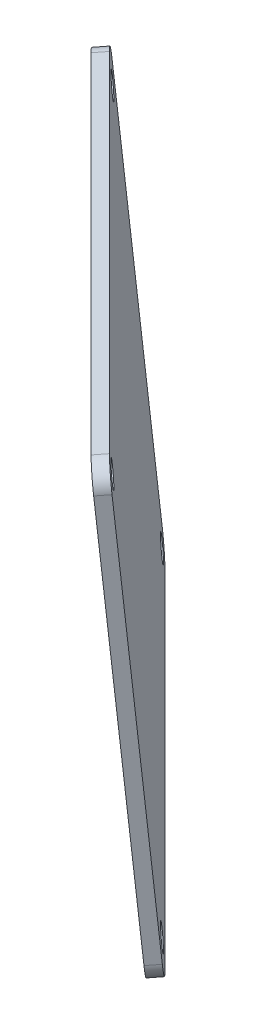
ISO-10303-21;
HEADER;
FILE_DESCRIPTION(('STEP AP214'),'2;1');
FILE_NAME('part.step','',(''),(''),'','','');
FILE_SCHEMA(('AUTOMOTIVE_DESIGN { 1 0 10303 214 1 1 1 1 }'));
ENDSEC;
DATA;
#1=APPLICATION_CONTEXT('core data for automotive mechanical design processes');
#2=APPLICATION_PROTOCOL_DEFINITION('international standard','automotive_design',2000,#1);
#3=PRODUCT_CONTEXT('',#1,'mechanical');
#4=PRODUCT('Part','Part','',(#3));
#5=PRODUCT_RELATED_PRODUCT_CATEGORY('part','',(#4));
#6=PRODUCT_DEFINITION_FORMATION('','',#4);
#7=PRODUCT_DEFINITION_CONTEXT('part definition',#1,'design');
#8=PRODUCT_DEFINITION('design','',#6,#7);
#9=PRODUCT_DEFINITION_SHAPE('','',#8);
#10=(LENGTH_UNIT() NAMED_UNIT(*) SI_UNIT(.MILLI.,.METRE.));
#11=(NAMED_UNIT(*) PLANE_ANGLE_UNIT() SI_UNIT($,.RADIAN.));
#12=(NAMED_UNIT(*) SI_UNIT($,.STERADIAN.) SOLID_ANGLE_UNIT());
#13=UNCERTAINTY_MEASURE_WITH_UNIT(LENGTH_MEASURE(1.E-05),#10,'distance_accuracy_value','');
#14=(GEOMETRIC_REPRESENTATION_CONTEXT(3) GLOBAL_UNCERTAINTY_ASSIGNED_CONTEXT((#13)) GLOBAL_UNIT_ASSIGNED_CONTEXT((#10,
#11,#12)) REPRESENTATION_CONTEXT('',''));
#15=CARTESIAN_POINT('',(0.,0.,0.));
#16=DIRECTION('',(0.,0.,1.));
#17=DIRECTION('',(1.,0.,0.));
#18=AXIS2_PLACEMENT_3D('',#15,#16,#17);
#19=CARTESIAN_POINT('',(24.477654356195,47.3995662297996,-60.7574005593814));
#20=DIRECTION('',(0.704416026402758,0.0871557427476584,-0.704416026402759));
#21=DIRECTION('',(-0.707106781186548,0.,-0.707106781186547));
#22=AXIS2_PLACEMENT_3D('',#19,#20,#21);
#23=CYLINDRICAL_SURFACE('',#22,2.54);
#24=CARTESIAN_POINT('',(25.5959147981094,47.5379259714115,-61.8756610012958));
#25=DIRECTION('',(0.704416026402758,0.0871557427476584,-0.704416026402759));
#26=DIRECTION('',(0.707106781186548,0.,0.707106781186547));
#27=AXIS2_PLACEMENT_3D('',#24,#25,#26);
#28=CIRCLE('',#27,2.54);
#29=CARTESIAN_POINT('',(25.7524509765686,45.0075914382585,-62.032197179755));
#30=VERTEX_POINT('',#29);
#31=CARTESIAN_POINT('',(23.7998635738956,47.5379259714115,-63.6717122255096));
#32=VERTEX_POINT('',#31);
#33=EDGE_CURVE('E130',#30,#32,#28,.T.);
#34=ORIENTED_EDGE('',*,*,#33,.F.);
#35=DIRECTION('',(0.704416026402758,0.0871557427476584,-0.704416026402759));
#36=VECTOR('',#35,1.);
#37=CARTESIAN_POINT('',(24.6341905346542,44.8692316966466,-60.9139367378406));
#38=LINE('',#37,#36);
#39=CARTESIAN_POINT('',(24.6341905346542,44.8692316966466,-60.9139367378406));
#40=VERTEX_POINT('',#39);
#41=EDGE_CURVE('E11',#40,#30,#38,.T.);
#42=ORIENTED_EDGE('',*,*,#41,.F.);
#43=CARTESIAN_POINT('',(24.477654356195,47.3995662297996,-60.7574005593814));
#44=DIRECTION('',(0.704416026402758,0.0871557427476584,-0.704416026402759));
#45=DIRECTION('',(0.707106781186548,0.,0.707106781186547));
#46=AXIS2_PLACEMENT_3D('',#43,#44,#45);
#47=CIRCLE('',#46,2.54);
#48=CARTESIAN_POINT('',(22.6816031319812,47.3995662297996,-62.5534517835953));
#49=VERTEX_POINT('',#48);
#50=EDGE_CURVE('E151',#40,#49,#47,.T.);
#51=ORIENTED_EDGE('',*,*,#50,.T.);
#52=DIRECTION('',(0.704416026402758,0.0871557427476584,-0.704416026402759));
#53=VECTOR('',#52,1.);
#54=CARTESIAN_POINT('',(22.6816031319812,47.3995662297996,-62.5534517835953));
#55=LINE('',#54,#53);
#56=EDGE_CURVE('E36',#49,#32,#55,.T.);
#57=ORIENTED_EDGE('',*,*,#56,.T.);
#58=EDGE_LOOP('',(#34,#42,#51,#57));
#59=FACE_BOUND('',#58,.T.);
#60=ADVANCED_FACE('F33',(#59),#23,.T.);
#61=CARTESIAN_POINT('',(24.6341905346542,44.8692316966466,-60.9139367378406));
#62=DIRECTION('',(0.0616284167162195,-0.996194698091745,-0.0616284167162195));
#63=DIRECTION('',(0.,0.0617457854184493,-0.998091908585106));
#64=AXIS2_PLACEMENT_3D('',#61,#62,#63);
#65=PLANE('',#64);
#66=DIRECTION('',(-0.707106781186548,0.,-0.707106781186547));
#67=VECTOR('',#66,1.);
#68=CARTESIAN_POINT('',(25.7524509765686,45.0075914382585,-62.032197179755));
#69=LINE('',#68,#67);
#70=CARTESIAN_POINT('',(68.1841611486203,45.0075914382585,-19.6004870077033));
#71=VERTEX_POINT('',#70);
#72=EDGE_CURVE('E149',#71,#30,#69,.T.);
#73=ORIENTED_EDGE('',*,*,#72,.F.);
#74=DIRECTION('',(0.704416026402758,0.0871557427476584,-0.704416026402759));
#75=VECTOR('',#74,1.);
#76=CARTESIAN_POINT('',(67.065900706706,44.8692316966466,-18.4822265657889));
#77=LINE('',#76,#75);
#78=CARTESIAN_POINT('',(67.065900706706,44.8692316966466,-18.4822265657889));
#79=VERTEX_POINT('',#78);
#80=EDGE_CURVE('E42',#79,#71,#77,.T.);
#81=ORIENTED_EDGE('',*,*,#80,.F.);
#82=DIRECTION('',(-0.707106781186548,0.,-0.707106781186547));
#83=VECTOR('',#82,1.);
#84=CARTESIAN_POINT('',(24.6341905346542,44.8692316966466,-60.9139367378406));
#85=LINE('',#84,#83);
#86=EDGE_CURVE('E120',#79,#40,#85,.T.);
#87=ORIENTED_EDGE('',*,*,#86,.T.);
#88=ORIENTED_EDGE('',*,*,#41,.T.);
#89=EDGE_LOOP('',(#73,#81,#87,#88));
#90=FACE_BOUND('',#89,.T.);
#91=ADVANCED_FACE('F163',(#90),#65,.T.);
#92=CARTESIAN_POINT('',(66.9093645282468,47.3995662297996,-18.3256903873297));
#93=DIRECTION('',(0.704416026402758,0.0871557427476584,-0.704416026402759));
#94=DIRECTION('',(-0.707106781186548,0.,-0.707106781186547));
#95=AXIS2_PLACEMENT_3D('',#92,#93,#94);
#96=CYLINDRICAL_SURFACE('',#95,2.54);
#97=CARTESIAN_POINT('',(68.0276249701612,47.5379259714115,-19.4439508292441));
#98=DIRECTION('',(0.704416026402758,0.0871557427476584,-0.704416026402759));
#99=DIRECTION('',(0.707106781186548,0.,0.707106781186547));
#100=AXIS2_PLACEMENT_3D('',#97,#98,#99);
#101=CIRCLE('',#100,2.54);
#102=CARTESIAN_POINT('',(69.823676194375,47.5379259714115,-17.6478996050302));
#103=VERTEX_POINT('',#102);
#104=EDGE_CURVE('E107',#103,#71,#101,.T.);
#105=ORIENTED_EDGE('',*,*,#104,.F.);
#106=DIRECTION('',(0.704416026402758,0.0871557427476584,-0.704416026402759));
#107=VECTOR('',#106,1.);
#108=CARTESIAN_POINT('',(68.7054157524606,47.3995662297996,-16.5296391631159));
#109=LINE('',#108,#107);
#110=CARTESIAN_POINT('',(68.7054157524606,47.3995662297996,-16.5296391631159));
#111=VERTEX_POINT('',#110);
#112=EDGE_CURVE('E102',#111,#103,#109,.T.);
#113=ORIENTED_EDGE('',*,*,#112,.F.);
#114=CARTESIAN_POINT('',(66.9093645282468,47.3995662297996,-18.3256903873297));
#115=DIRECTION('',(0.704416026402758,0.0871557427476584,-0.704416026402759));
#116=DIRECTION('',(0.707106781186548,0.,0.707106781186547));
#117=AXIS2_PLACEMENT_3D('',#114,#115,#116);
#118=CIRCLE('',#117,2.54);
#119=EDGE_CURVE('E105',#111,#79,#118,.T.);
#120=ORIENTED_EDGE('',*,*,#119,.T.);
#121=ORIENTED_EDGE('',*,*,#80,.T.);
#122=EDGE_LOOP('',(#105,#113,#120,#121));
#123=FACE_BOUND('',#122,.T.);
#124=ADVANCED_FACE('F104',(#123),#96,.T.);
#125=CARTESIAN_POINT('',(65.6406021531542,96.9408528789011,-13.4648255638095));
#126=DIRECTION('',(0.707106781186548,0.,0.707106781186547));
#127=DIRECTION('',(0.707106781186547,0.,-0.707106781186548));
#128=AXIS2_PLACEMENT_3D('',#125,#126,#127);
#129=PLANE('',#128);
#130=DIRECTION('',(0.0616284167162195,-0.996194698091746,-0.0616284167162196));
#131=VECTOR('',#130,1.);
#132=CARTESIAN_POINT('',(66.7588625950686,97.079212620513,-14.5830860057238));
#133=LINE('',#132,#131);
#134=CARTESIAN_POINT('',(66.7588625950686,97.079212620513,-14.5830860057238));
#135=VERTEX_POINT('',#134);
#136=EDGE_CURVE('E146',#135,#103,#133,.T.);
#137=ORIENTED_EDGE('',*,*,#136,.F.);
#138=DIRECTION('',(0.704416026402758,0.0871557427476584,-0.704416026402759));
#139=VECTOR('',#138,1.);
#140=CARTESIAN_POINT('',(65.6406021531542,96.9408528789011,-13.4648255638095));
#141=LINE('',#140,#139);
#142=CARTESIAN_POINT('',(65.6406021531542,96.9408528789011,-13.4648255638095));
#143=VERTEX_POINT('',#142);
#144=EDGE_CURVE('E112',#143,#135,#141,.T.);
#145=ORIENTED_EDGE('',*,*,#144,.F.);
#146=DIRECTION('',(0.0616284167162195,-0.996194698091746,-0.0616284167162196));
#147=VECTOR('',#146,1.);
#148=CARTESIAN_POINT('',(65.6406021531542,96.9408528789011,-13.4648255638095));
#149=LINE('',#148,#147);
#150=EDGE_CURVE('E118',#143,#111,#149,.T.);
#151=ORIENTED_EDGE('',*,*,#150,.T.);
#152=ORIENTED_EDGE('',*,*,#112,.T.);
#153=EDGE_LOOP('',(#137,#145,#151,#152));
#154=FACE_BOUND('',#153,.T.);
#155=ADVANCED_FACE('F122',(#154),#129,.T.);
#156=CARTESIAN_POINT('',(63.8445509289404,96.9408528789011,-15.2608767880233));
#157=DIRECTION('',(0.704416026402758,0.0871557427476584,-0.704416026402759));
#158=DIRECTION('',(-0.707106781186548,0.,-0.707106781186547));
#159=AXIS2_PLACEMENT_3D('',#156,#157,#158);
#160=CYLINDRICAL_SURFACE('',#159,2.53999999999999);
#161=CARTESIAN_POINT('',(64.9628113708548,97.079212620513,-16.3791372299377));
#162=DIRECTION('',(0.704416026402758,0.0871557427476584,-0.704416026402759));
#163=DIRECTION('',(-0.707106781186548,0.,-0.707106781186547));
#164=AXIS2_PLACEMENT_3D('',#161,#162,#163);
#165=CIRCLE('',#164,2.53999999999999);
#166=CARTESIAN_POINT('',(64.8062751923956,99.609547153666,-16.2226010514785));
#167=VERTEX_POINT('',#166);
#168=EDGE_CURVE('E143',#167,#135,#165,.T.);
#169=ORIENTED_EDGE('',*,*,#168,.F.);
#170=DIRECTION('',(0.704416026402758,0.0871557427476584,-0.704416026402759));
#171=VECTOR('',#170,1.);
#172=CARTESIAN_POINT('',(63.6880147504812,99.4711874120541,-15.1043406095641));
#173=LINE('',#172,#171);
#174=CARTESIAN_POINT('',(63.6880147504812,99.4711874120541,-15.1043406095641));
#175=VERTEX_POINT('',#174);
#176=EDGE_CURVE('E155',#175,#167,#173,.T.);
#177=ORIENTED_EDGE('',*,*,#176,.F.);
#178=CARTESIAN_POINT('',(63.8445509289404,96.9408528789011,-15.2608767880233));
#179=DIRECTION('',(0.704416026402758,0.0871557427476584,-0.704416026402759));
#180=DIRECTION('',(-0.707106781186548,0.,-0.707106781186547));
#181=AXIS2_PLACEMENT_3D('',#178,#179,#180);
#182=CIRCLE('',#181,2.53999999999999);
#183=EDGE_CURVE('E123',#175,#143,#182,.T.);
#184=ORIENTED_EDGE('',*,*,#183,.T.);
#185=ORIENTED_EDGE('',*,*,#144,.T.);
#186=EDGE_LOOP('',(#169,#177,#184,#185));
#187=FACE_BOUND('',#186,.T.);
#188=ADVANCED_FACE('F176',(#187),#160,.T.);
#189=CARTESIAN_POINT('',(21.2563045784294,99.4711874120542,-57.5360507816158));
#190=DIRECTION('',(-0.0616284167162192,0.996194698091746,0.0616284167162199));
#191=DIRECTION('',(0.,-0.0617457854184496,0.998091908585106));
#192=AXIS2_PLACEMENT_3D('',#189,#190,#191);
#193=PLANE('',#192);
#194=DIRECTION('',(0.707106781186548,0.,0.707106781186547));
#195=VECTOR('',#194,1.);
#196=CARTESIAN_POINT('',(22.3745650203438,99.6095471536661,-58.6543112235302));
#197=LINE('',#196,#195);
#198=CARTESIAN_POINT('',(22.3745650203438,99.6095471536661,-58.6543112235302));
#199=VERTEX_POINT('',#198);
#200=EDGE_CURVE('E140',#199,#167,#197,.T.);
#201=ORIENTED_EDGE('',*,*,#200,.F.);
#202=DIRECTION('',(0.704416026402758,0.0871557427476584,-0.704416026402759));
#203=VECTOR('',#202,1.);
#204=CARTESIAN_POINT('',(21.2563045784294,99.4711874120542,-57.5360507816158));
#205=LINE('',#204,#203);
#206=CARTESIAN_POINT('',(21.2563045784294,99.4711874120542,-57.5360507816158));
#207=VERTEX_POINT('',#206);
#208=EDGE_CURVE('E157',#207,#199,#205,.T.);
#209=ORIENTED_EDGE('',*,*,#208,.F.);
#210=DIRECTION('',(0.707106781186548,0.,0.707106781186547));
#211=VECTOR('',#210,1.);
#212=CARTESIAN_POINT('',(21.2563045784294,99.4711874120542,-57.5360507816158));
#213=LINE('',#212,#211);
#214=EDGE_CURVE('E125',#207,#175,#213,.T.);
#215=ORIENTED_EDGE('',*,*,#214,.T.);
#216=ORIENTED_EDGE('',*,*,#176,.T.);
#217=EDGE_LOOP('',(#201,#209,#215,#216));
#218=FACE_BOUND('',#217,.T.);
#219=ADVANCED_FACE('F179',(#218),#193,.T.);
#220=CARTESIAN_POINT('',(21.4128407568886,96.9408528789011,-57.692586960075));
#221=DIRECTION('',(0.704416026402758,0.0871557427476584,-0.704416026402759));
#222=DIRECTION('',(-0.707106781186548,0.,-0.707106781186547));
#223=AXIS2_PLACEMENT_3D('',#220,#221,#222);
#224=CYLINDRICAL_SURFACE('',#223,2.54);
#225=CARTESIAN_POINT('',(22.531101198803,97.079212620513,-58.8108474019894));
#226=DIRECTION('',(0.704416026402758,0.0871557427476584,-0.704416026402759));
#227=DIRECTION('',(0.707106781186548,0.,0.707106781186547));
#228=AXIS2_PLACEMENT_3D('',#225,#226,#227);
#229=CIRCLE('',#228,2.54);
#230=CARTESIAN_POINT('',(20.7350499745892,97.079212620513,-60.6068986262032));
#231=VERTEX_POINT('',#230);
#232=EDGE_CURVE('E137',#231,#199,#229,.T.);
#233=ORIENTED_EDGE('',*,*,#232,.F.);
#234=DIRECTION('',(0.704416026402758,0.0871557427476584,-0.704416026402759));
#235=VECTOR('',#234,1.);
#236=CARTESIAN_POINT('',(19.6167895326748,96.9408528789011,-59.4886381842889));
#237=LINE('',#236,#235);
#238=CARTESIAN_POINT('',(19.6167895326748,96.9408528789011,-59.4886381842889));
#239=VERTEX_POINT('',#238);
#240=EDGE_CURVE('E158',#239,#231,#237,.T.);
#241=ORIENTED_EDGE('',*,*,#240,.F.);
#242=CARTESIAN_POINT('',(21.4128407568886,96.9408528789011,-57.692586960075));
#243=DIRECTION('',(0.704416026402758,0.0871557427476584,-0.704416026402759));
#244=DIRECTION('',(0.707106781186548,0.,0.707106781186547));
#245=AXIS2_PLACEMENT_3D('',#242,#243,#244);
#246=CIRCLE('',#245,2.54);
#247=EDGE_CURVE('E245',#239,#207,#246,.T.);
#248=ORIENTED_EDGE('',*,*,#247,.T.);
#249=ORIENTED_EDGE('',*,*,#208,.T.);
#250=EDGE_LOOP('',(#233,#241,#248,#249));
#251=FACE_BOUND('',#250,.T.);
#252=ADVANCED_FACE('F183',(#251),#224,.T.);
#253=CARTESIAN_POINT('',(19.6167895326748,96.9408528789011,-59.4886381842889));
#254=DIRECTION('',(-0.707106781186548,0.,-0.707106781186547));
#255=DIRECTION('',(-0.707106781186547,0.,0.707106781186548));
#256=AXIS2_PLACEMENT_3D('',#253,#254,#255);
#257=PLANE('',#256);
#258=DIRECTION('',(-0.0616284167162194,0.996194698091746,0.0616284167162195));
#259=VECTOR('',#258,1.);
#260=CARTESIAN_POINT('',(20.7350499745892,97.079212620513,-60.6068986262032));
#261=LINE('',#260,#259);
#262=EDGE_CURVE('E133',#32,#231,#261,.T.);
#263=ORIENTED_EDGE('',*,*,#262,.F.);
#264=ORIENTED_EDGE('',*,*,#56,.F.);
#265=DIRECTION('',(-0.0616284167162194,0.996194698091746,0.0616284167162195));
#266=VECTOR('',#265,1.);
#267=CARTESIAN_POINT('',(19.6167895326748,96.9408528789011,-59.4886381842889));
#268=LINE('',#267,#266);
#269=EDGE_CURVE('E243',#49,#239,#268,.T.);
#270=ORIENTED_EDGE('',*,*,#269,.T.);
#271=ORIENTED_EDGE('',*,*,#240,.T.);
#272=EDGE_LOOP('',(#263,#264,#270,#271));
#273=FACE_BOUND('',#272,.T.);
#274=ADVANCED_FACE('F160',(#273),#257,.T.);
#275=CARTESIAN_POINT('',(24.477654356195,47.3995662297996,-60.7574005593814));
#276=DIRECTION('',(-0.704416026402758,-0.0871557427476584,0.704416026402759));
#277=DIRECTION('',(0.707106781186548,0.,0.707106781186547));
#278=AXIS2_PLACEMENT_3D('',#275,#276,#277);
#279=PLANE('',#278);
#280=CARTESIAN_POINT('',(25.1649401901061,47.7634882646428,-60.0250875056739));
#281=DIRECTION('',(0.704416026402758,0.0871557427476584,-0.704416026402759));
#282=DIRECTION('',(-0.707106781186548,0.,-0.707106781186547));
#283=AXIS2_PLACEMENT_3D('',#280,#281,#282);
#284=CIRCLE('',#283,1.4499971);
#285=CARTESIAN_POINT('',(24.1396374079953,47.7634882646428,-61.0503902877847));
#286=VERTEX_POINT('',#285);
#287=EDGE_CURVE('E218',#286,#286,#284,.T.);
#288=ORIENTED_EDGE('',*,*,#287,.T.);
#289=EDGE_LOOP('',(#288));
#290=FACE_BOUND('',#289,.T.);
#291=CARTESIAN_POINT('',(66.1770514745392,47.7634882646428,-19.0129762212407));
#292=DIRECTION('',(0.704416026402758,0.0871557427476584,-0.704416026402759));
#293=DIRECTION('',(-0.707106781186548,0.,-0.707106781186547));
#294=AXIS2_PLACEMENT_3D('',#291,#292,#293);
#295=CIRCLE('',#294,1.4499971);
#296=CARTESIAN_POINT('',(65.1517486924284,47.7634882646428,-20.0382790033516));
#297=VERTEX_POINT('',#296);
#298=EDGE_CURVE('E226',#297,#297,#295,.T.);
#299=ORIENTED_EDGE('',*,*,#298,.T.);
#300=EDGE_LOOP('',(#299));
#301=FACE_BOUND('',#300,.T.);
#302=CARTESIAN_POINT('',(63.1572650950293,96.5769308440579,-15.9931898417308));
#303=DIRECTION('',(0.704416026402758,0.0871557427476584,-0.704416026402759));
#304=DIRECTION('',(-0.707106781186548,0.,-0.707106781186547));
#305=AXIS2_PLACEMENT_3D('',#302,#303,#304);
#306=CIRCLE('',#305,1.4499971);
#307=CARTESIAN_POINT('',(62.1319623129185,96.5769308440579,-17.0184926238417));
#308=VERTEX_POINT('',#307);
#309=EDGE_CURVE('E232',#308,#308,#306,.T.);
#310=ORIENTED_EDGE('',*,*,#309,.T.);
#311=EDGE_LOOP('',(#310));
#312=FACE_BOUND('',#311,.T.);
#313=CARTESIAN_POINT('',(22.1451538105962,96.5769308440579,-57.0053011261639));
#314=DIRECTION('',(0.704416026402758,0.0871557427476584,-0.704416026402759));
#315=DIRECTION('',(-0.707106781186548,0.,-0.707106781186547));
#316=AXIS2_PLACEMENT_3D('',#313,#314,#315);
#317=CIRCLE('',#316,1.4499971);
#318=CARTESIAN_POINT('',(21.1198510284853,96.5769308440579,-58.0306039082748));
#319=VERTEX_POINT('',#318);
#320=EDGE_CURVE('E134',#319,#319,#317,.T.);
#321=ORIENTED_EDGE('',*,*,#320,.T.);
#322=EDGE_LOOP('',(#321));
#323=FACE_BOUND('',#322,.T.);
#324=ORIENTED_EDGE('',*,*,#50,.F.);
#325=ORIENTED_EDGE('',*,*,#86,.F.);
#326=ORIENTED_EDGE('',*,*,#119,.F.);
#327=ORIENTED_EDGE('',*,*,#150,.F.);
#328=ORIENTED_EDGE('',*,*,#183,.F.);
#329=ORIENTED_EDGE('',*,*,#214,.F.);
#330=ORIENTED_EDGE('',*,*,#247,.F.);
#331=ORIENTED_EDGE('',*,*,#269,.F.);
#332=EDGE_LOOP('',(#324,#325,#326,#327,#328,#329,#330,#331));
#333=FACE_BOUND('',#332,.T.);
#334=ADVANCED_FACE('F116',(#290,#301,#312,#323,#333),#279,.T.);
#335=CARTESIAN_POINT('',(25.5959147981094,47.5379259714115,-61.8756610012958));
#336=DIRECTION('',(-0.704416026402758,-0.0871557427476584,0.704416026402759));
#337=DIRECTION('',(0.707106781186548,0.,0.707106781186547));
#338=AXIS2_PLACEMENT_3D('',#335,#336,#337);
#339=PLANE('',#338);
#340=CARTESIAN_POINT('',(26.2832006320205,47.9018480062547,-61.1433479475883));
#341=DIRECTION('',(0.704416026402758,0.0871557427476584,-0.704416026402759));
#342=DIRECTION('',(-0.707106781186548,0.,-0.707106781186547));
#343=AXIS2_PLACEMENT_3D('',#340,#341,#342);
#344=CIRCLE('',#343,1.4499971);
#345=CARTESIAN_POINT('',(25.2578978499096,47.9018480062547,-62.1686507296991));
#346=VERTEX_POINT('',#345);
#347=EDGE_CURVE('E221',#346,#346,#344,.T.);
#348=ORIENTED_EDGE('',*,*,#347,.F.);
#349=EDGE_LOOP('',(#348));
#350=FACE_BOUND('',#349,.T.);
#351=CARTESIAN_POINT('',(67.2953119164536,47.9018480062547,-20.1312366631551));
#352=DIRECTION('',(0.704416026402758,0.0871557427476584,-0.704416026402759));
#353=DIRECTION('',(-0.707106781186548,0.,-0.707106781186547));
#354=AXIS2_PLACEMENT_3D('',#351,#352,#353);
#355=CIRCLE('',#354,1.4499971);
#356=CARTESIAN_POINT('',(66.2700091343428,47.9018480062547,-21.156539445266));
#357=VERTEX_POINT('',#356);
#358=EDGE_CURVE('E223',#357,#357,#355,.T.);
#359=ORIENTED_EDGE('',*,*,#358,.F.);
#360=EDGE_LOOP('',(#359));
#361=FACE_BOUND('',#360,.T.);
#362=CARTESIAN_POINT('',(64.2755255369437,96.7152905856698,-17.1114502836452));
#363=DIRECTION('',(0.704416026402758,0.0871557427476584,-0.704416026402759));
#364=DIRECTION('',(-0.707106781186548,0.,-0.707106781186547));
#365=AXIS2_PLACEMENT_3D('',#362,#363,#364);
#366=CIRCLE('',#365,1.4499971);
#367=CARTESIAN_POINT('',(63.2502227548329,96.7152905856698,-18.136753065756));
#368=VERTEX_POINT('',#367);
#369=EDGE_CURVE('E229',#368,#368,#366,.T.);
#370=ORIENTED_EDGE('',*,*,#369,.F.);
#371=EDGE_LOOP('',(#370));
#372=FACE_BOUND('',#371,.T.);
#373=CARTESIAN_POINT('',(23.2634142525105,96.7152905856698,-58.1235615680783));
#374=DIRECTION('',(0.704416026402758,0.0871557427476584,-0.704416026402759));
#375=DIRECTION('',(-0.707106781186548,0.,-0.707106781186547));
#376=AXIS2_PLACEMENT_3D('',#373,#374,#375);
#377=CIRCLE('',#376,1.4499971);
#378=CARTESIAN_POINT('',(22.2381114703997,96.7152905856698,-59.1488643501892));
#379=VERTEX_POINT('',#378);
#380=EDGE_CURVE('E235',#379,#379,#377,.T.);
#381=ORIENTED_EDGE('',*,*,#380,.F.);
#382=EDGE_LOOP('',(#381));
#383=FACE_BOUND('',#382,.T.);
#384=ORIENTED_EDGE('',*,*,#33,.T.);
#385=ORIENTED_EDGE('',*,*,#262,.T.);
#386=ORIENTED_EDGE('',*,*,#232,.T.);
#387=ORIENTED_EDGE('',*,*,#200,.T.);
#388=ORIENTED_EDGE('',*,*,#168,.T.);
#389=ORIENTED_EDGE('',*,*,#136,.T.);
#390=ORIENTED_EDGE('',*,*,#104,.T.);
#391=ORIENTED_EDGE('',*,*,#72,.T.);
#392=EDGE_LOOP('',(#384,#385,#386,#387,#388,#389,#390,#391));
#393=FACE_BOUND('',#392,.T.);
#394=ADVANCED_FACE('F162',(#350,#361,#372,#383,#393),#339,.F.);
#395=CARTESIAN_POINT('',(22.1451538105962,96.5769308440579,-57.0053011261639));
#396=DIRECTION('',(0.704416026402758,0.0871557427476584,-0.704416026402759));
#397=DIRECTION('',(-0.707106781186548,0.,-0.707106781186547));
#398=AXIS2_PLACEMENT_3D('',#395,#396,#397);
#399=CYLINDRICAL_SURFACE('',#398,1.4499971);
#400=ORIENTED_EDGE('',*,*,#320,.F.);
#401=EDGE_LOOP('',(#400));
#402=FACE_BOUND('',#401,.T.);
#403=ORIENTED_EDGE('',*,*,#380,.T.);
#404=EDGE_LOOP('',(#403));
#405=FACE_BOUND('',#404,.T.);
#406=ADVANCED_FACE('F195',(#402,#405),#399,.F.);
#407=CARTESIAN_POINT('',(63.1572650950293,96.5769308440579,-15.9931898417308));
#408=DIRECTION('',(0.704416026402758,0.0871557427476584,-0.704416026402759));
#409=DIRECTION('',(-0.707106781186548,0.,-0.707106781186547));
#410=AXIS2_PLACEMENT_3D('',#407,#408,#409);
#411=CYLINDRICAL_SURFACE('',#410,1.4499971);
#412=ORIENTED_EDGE('',*,*,#309,.F.);
#413=EDGE_LOOP('',(#412));
#414=FACE_BOUND('',#413,.T.);
#415=ORIENTED_EDGE('',*,*,#369,.T.);
#416=EDGE_LOOP('',(#415));
#417=FACE_BOUND('',#416,.T.);
#418=ADVANCED_FACE('F202',(#414,#417),#411,.F.);
#419=CARTESIAN_POINT('',(66.1770514745392,47.7634882646428,-19.0129762212407));
#420=DIRECTION('',(0.704416026402758,0.0871557427476584,-0.704416026402759));
#421=DIRECTION('',(-0.707106781186548,0.,-0.707106781186547));
#422=AXIS2_PLACEMENT_3D('',#419,#420,#421);
#423=CYLINDRICAL_SURFACE('',#422,1.4499971);
#424=ORIENTED_EDGE('',*,*,#298,.F.);
#425=EDGE_LOOP('',(#424));
#426=FACE_BOUND('',#425,.T.);
#427=ORIENTED_EDGE('',*,*,#358,.T.);
#428=EDGE_LOOP('',(#427));
#429=FACE_BOUND('',#428,.T.);
#430=ADVANCED_FACE('F206',(#426,#429),#423,.F.);
#431=CARTESIAN_POINT('',(25.1649401901061,47.7634882646428,-60.0250875056739));
#432=DIRECTION('',(0.704416026402758,0.0871557427476584,-0.704416026402759));
#433=DIRECTION('',(-0.707106781186548,0.,-0.707106781186547));
#434=AXIS2_PLACEMENT_3D('',#431,#432,#433);
#435=CYLINDRICAL_SURFACE('',#434,1.4499971);
#436=ORIENTED_EDGE('',*,*,#287,.F.);
#437=EDGE_LOOP('',(#436));
#438=FACE_BOUND('',#437,.T.);
#439=ORIENTED_EDGE('',*,*,#347,.T.);
#440=EDGE_LOOP('',(#439));
#441=FACE_BOUND('',#440,.T.);
#442=ADVANCED_FACE('F210',(#438,#441),#435,.F.);
#443=CLOSED_SHELL('',(#60,#91,#124,#155,#188,#219,#252,#274,#334,#394,#406,#418,#430,#442));
#444=MANIFOLD_SOLID_BREP('B2',#443);
#445=ADVANCED_BREP_SHAPE_REPRESENTATION('',(#18,#444),#14);
#446=SHAPE_DEFINITION_REPRESENTATION(#9,#445);
ENDSEC;
END-ISO-10303-21;
